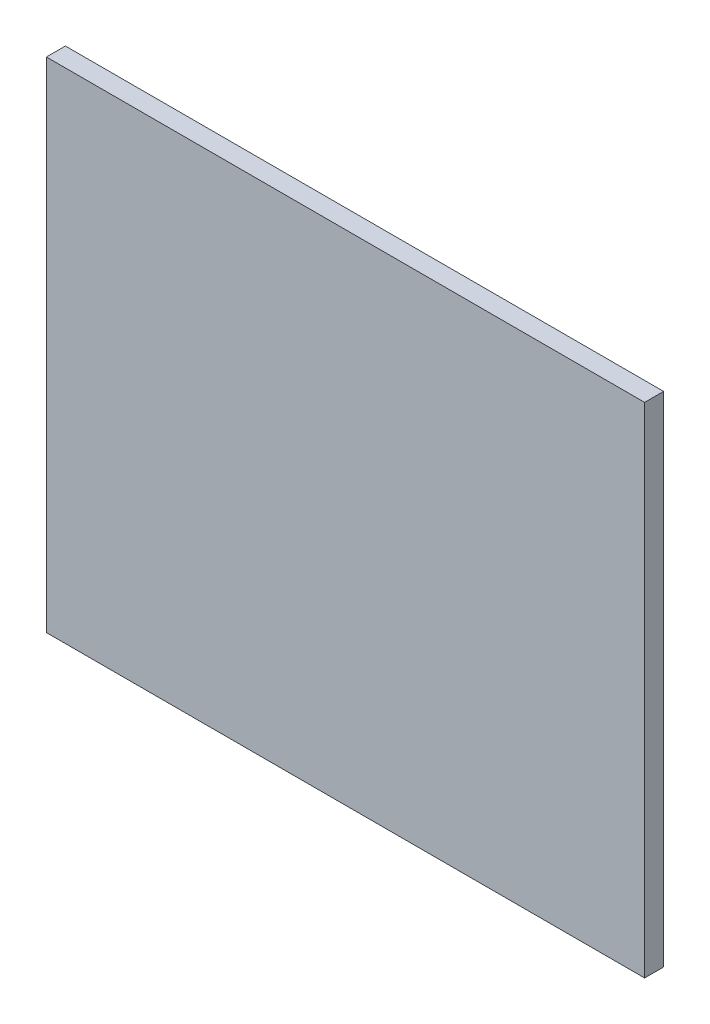
ISO-10303-21;
HEADER;
FILE_DESCRIPTION(('STEP AP214'),'2;1');
FILE_NAME('part.step','',(''),(''),'','','');
FILE_SCHEMA(('AUTOMOTIVE_DESIGN { 1 0 10303 214 1 1 1 1 }'));
ENDSEC;
DATA;
#1=APPLICATION_CONTEXT('core data for automotive mechanical design processes');
#2=APPLICATION_PROTOCOL_DEFINITION('international standard','automotive_design',2000,#1);
#3=PRODUCT_CONTEXT('',#1,'mechanical');
#4=PRODUCT('Part','Part','',(#3));
#5=PRODUCT_RELATED_PRODUCT_CATEGORY('part','',(#4));
#6=PRODUCT_DEFINITION_FORMATION('','',#4);
#7=PRODUCT_DEFINITION_CONTEXT('part definition',#1,'design');
#8=PRODUCT_DEFINITION('design','',#6,#7);
#9=PRODUCT_DEFINITION_SHAPE('','',#8);
#10=(LENGTH_UNIT() NAMED_UNIT(*) SI_UNIT(.MILLI.,.METRE.));
#11=(NAMED_UNIT(*) PLANE_ANGLE_UNIT() SI_UNIT($,.RADIAN.));
#12=(NAMED_UNIT(*) SI_UNIT($,.STERADIAN.) SOLID_ANGLE_UNIT());
#13=UNCERTAINTY_MEASURE_WITH_UNIT(LENGTH_MEASURE(1.E-05),#10,'distance_accuracy_value','');
#14=(GEOMETRIC_REPRESENTATION_CONTEXT(3) GLOBAL_UNCERTAINTY_ASSIGNED_CONTEXT((#13)) GLOBAL_UNIT_ASSIGNED_CONTEXT((#10,
#11,#12)) REPRESENTATION_CONTEXT('',''));
#15=CARTESIAN_POINT('',(0.,0.,0.));
#16=DIRECTION('',(0.,0.,1.));
#17=DIRECTION('',(1.,0.,0.));
#18=AXIS2_PLACEMENT_3D('',#15,#16,#17);
#19=CARTESIAN_POINT('',(0.,-250.,19.05));
#20=DIRECTION('',(0.,1.,0.));
#21=DIRECTION('',(0.,0.,1.));
#22=AXIS2_PLACEMENT_3D('',#19,#20,#21);
#23=PLANE('',#22);
#24=DIRECTION('',(1.,0.,0.));
#25=VECTOR('',#24,1.);
#26=CARTESIAN_POINT('',(0.,-250.,0.));
#27=LINE('',#26,#25);
#28=CARTESIAN_POINT('',(-300.,-250.,0.));
#29=VERTEX_POINT('',#28);
#30=CARTESIAN_POINT('',(300.,-250.,0.));
#31=VERTEX_POINT('',#30);
#32=EDGE_CURVE('E97',#29,#31,#27,.T.);
#33=ORIENTED_EDGE('',*,*,#32,.T.);
#34=DIRECTION('',(0.,0.,-1.));
#35=VECTOR('',#34,1.);
#36=CARTESIAN_POINT('',(300.,-250.,19.05));
#37=LINE('',#36,#35);
#38=CARTESIAN_POINT('',(300.,-250.,19.05));
#39=VERTEX_POINT('',#38);
#40=EDGE_CURVE('E11',#39,#31,#37,.T.);
#41=ORIENTED_EDGE('',*,*,#40,.F.);
#42=DIRECTION('',(1.,0.,0.));
#43=VECTOR('',#42,1.);
#44=CARTESIAN_POINT('',(0.,-250.,19.05));
#45=LINE('',#44,#43);
#46=CARTESIAN_POINT('',(-300.,-250.,19.05));
#47=VERTEX_POINT('',#46);
#48=EDGE_CURVE('E83',#47,#39,#45,.T.);
#49=ORIENTED_EDGE('',*,*,#48,.F.);
#50=DIRECTION('',(0.,0.,-1.));
#51=VECTOR('',#50,1.);
#52=CARTESIAN_POINT('',(-300.,-250.,19.05));
#53=LINE('',#52,#51);
#54=EDGE_CURVE('E50',#47,#29,#53,.T.);
#55=ORIENTED_EDGE('',*,*,#54,.T.);
#56=EDGE_LOOP('',(#33,#41,#49,#55));
#57=FACE_BOUND('',#56,.T.);
#58=ADVANCED_FACE('F34',(#57),#23,.F.);
#59=CARTESIAN_POINT('',(300.,0.,19.05));
#60=DIRECTION('',(-1.,0.,0.));
#61=DIRECTION('',(0.,0.,1.));
#62=AXIS2_PLACEMENT_3D('',#59,#60,#61);
#63=PLANE('',#62);
#64=DIRECTION('',(0.,1.,0.));
#65=VECTOR('',#64,1.);
#66=CARTESIAN_POINT('',(300.,0.,0.));
#67=LINE('',#66,#65);
#68=CARTESIAN_POINT('',(300.,250.,0.));
#69=VERTEX_POINT('',#68);
#70=EDGE_CURVE('E88',#31,#69,#67,.T.);
#71=ORIENTED_EDGE('',*,*,#70,.T.);
#72=DIRECTION('',(0.,0.,-1.));
#73=VECTOR('',#72,1.);
#74=CARTESIAN_POINT('',(300.,250.,19.05));
#75=LINE('',#74,#73);
#76=CARTESIAN_POINT('',(300.,250.,19.05));
#77=VERTEX_POINT('',#76);
#78=EDGE_CURVE('E42',#77,#69,#75,.T.);
#79=ORIENTED_EDGE('',*,*,#78,.F.);
#80=DIRECTION('',(0.,1.,0.));
#81=VECTOR('',#80,1.);
#82=CARTESIAN_POINT('',(300.,0.,19.05));
#83=LINE('',#82,#81);
#84=EDGE_CURVE('E76',#39,#77,#83,.T.);
#85=ORIENTED_EDGE('',*,*,#84,.F.);
#86=ORIENTED_EDGE('',*,*,#40,.T.);
#87=EDGE_LOOP('',(#71,#79,#85,#86));
#88=FACE_BOUND('',#87,.T.);
#89=ADVANCED_FACE('F87',(#88),#63,.F.);
#90=CARTESIAN_POINT('',(0.,250.,19.05));
#91=DIRECTION('',(0.,-1.,0.));
#92=DIRECTION('',(1.,0.,0.));
#93=AXIS2_PLACEMENT_3D('',#90,#91,#92);
#94=PLANE('',#93);
#95=DIRECTION('',(-1.,0.,0.));
#96=VECTOR('',#95,1.);
#97=CARTESIAN_POINT('',(0.,250.,0.));
#98=LINE('',#97,#96);
#99=CARTESIAN_POINT('',(-300.,250.,0.));
#100=VERTEX_POINT('',#99);
#101=EDGE_CURVE('E100',#69,#100,#98,.T.);
#102=ORIENTED_EDGE('',*,*,#101,.T.);
#103=DIRECTION('',(0.,0.,-1.));
#104=VECTOR('',#103,1.);
#105=CARTESIAN_POINT('',(-300.,250.,19.05));
#106=LINE('',#105,#104);
#107=CARTESIAN_POINT('',(-300.,250.,19.05));
#108=VERTEX_POINT('',#107);
#109=EDGE_CURVE('E65',#108,#100,#106,.T.);
#110=ORIENTED_EDGE('',*,*,#109,.F.);
#111=DIRECTION('',(-1.,0.,0.));
#112=VECTOR('',#111,1.);
#113=CARTESIAN_POINT('',(0.,250.,19.05));
#114=LINE('',#113,#112);
#115=EDGE_CURVE('E82',#77,#108,#114,.T.);
#116=ORIENTED_EDGE('',*,*,#115,.F.);
#117=ORIENTED_EDGE('',*,*,#78,.T.);
#118=EDGE_LOOP('',(#102,#110,#116,#117));
#119=FACE_BOUND('',#118,.T.);
#120=ADVANCED_FACE('F91',(#119),#94,.F.);
#121=CARTESIAN_POINT('',(-300.,0.,19.05));
#122=DIRECTION('',(-1.,0.,0.));
#123=DIRECTION('',(0.,0.,1.));
#124=AXIS2_PLACEMENT_3D('',#121,#122,#123);
#125=PLANE('',#124);
#126=DIRECTION('',(0.,1.,0.));
#127=VECTOR('',#126,1.);
#128=CARTESIAN_POINT('',(-300.,0.,0.));
#129=LINE('',#128,#127);
#130=EDGE_CURVE('E102',#29,#100,#129,.T.);
#131=ORIENTED_EDGE('',*,*,#130,.F.);
#132=ORIENTED_EDGE('',*,*,#54,.F.);
#133=DIRECTION('',(0.,1.,0.));
#134=VECTOR('',#133,1.);
#135=CARTESIAN_POINT('',(-300.,0.,19.05));
#136=LINE('',#135,#134);
#137=EDGE_CURVE('E92',#47,#108,#136,.T.);
#138=ORIENTED_EDGE('',*,*,#137,.T.);
#139=ORIENTED_EDGE('',*,*,#109,.T.);
#140=EDGE_LOOP('',(#131,#132,#138,#139));
#141=FACE_BOUND('',#140,.T.);
#142=ADVANCED_FACE('F108',(#141),#125,.T.);
#143=CARTESIAN_POINT('',(0.,0.,19.05));
#144=DIRECTION('',(0.,0.,1.));
#145=DIRECTION('',(1.,0.,0.));
#146=AXIS2_PLACEMENT_3D('',#143,#144,#145);
#147=PLANE('',#146);
#148=ORIENTED_EDGE('',*,*,#48,.T.);
#149=ORIENTED_EDGE('',*,*,#84,.T.);
#150=ORIENTED_EDGE('',*,*,#115,.T.);
#151=ORIENTED_EDGE('',*,*,#137,.F.);
#152=EDGE_LOOP('',(#148,#149,#150,#151));
#153=FACE_BOUND('',#152,.T.);
#154=ADVANCED_FACE('F79',(#153),#147,.T.);
#155=CARTESIAN_POINT('',(0.,0.,0.));
#156=DIRECTION('',(0.,0.,1.));
#157=DIRECTION('',(1.,0.,0.));
#158=AXIS2_PLACEMENT_3D('',#155,#156,#157);
#159=PLANE('',#158);
#160=ORIENTED_EDGE('',*,*,#32,.F.);
#161=ORIENTED_EDGE('',*,*,#130,.T.);
#162=ORIENTED_EDGE('',*,*,#101,.F.);
#163=ORIENTED_EDGE('',*,*,#70,.F.);
#164=EDGE_LOOP('',(#160,#161,#162,#163));
#165=FACE_BOUND('',#164,.T.);
#166=ADVANCED_FACE('F107',(#165),#159,.F.);
#167=CLOSED_SHELL('',(#58,#89,#120,#142,#154,#166));
#168=MANIFOLD_SOLID_BREP('B2',#167);
#169=ADVANCED_BREP_SHAPE_REPRESENTATION('',(#18,#168),#14);
#170=SHAPE_DEFINITION_REPRESENTATION(#9,#169);
ENDSEC;
END-ISO-10303-21;
